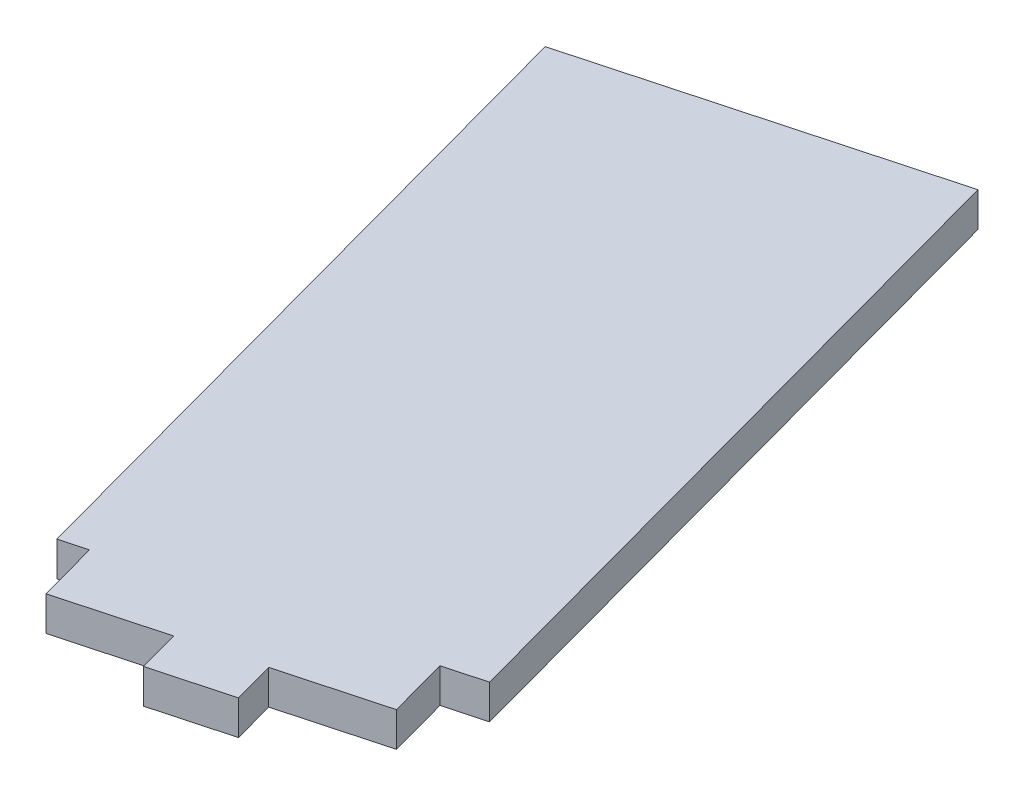
ISO-10303-21;
HEADER;
FILE_DESCRIPTION(('STEP AP214'),'2;1');
FILE_NAME('part.step','',(''),(''),'','','');
FILE_SCHEMA(('AUTOMOTIVE_DESIGN { 1 0 10303 214 1 1 1 1 }'));
ENDSEC;
DATA;
#1=APPLICATION_CONTEXT('core data for automotive mechanical design processes');
#2=APPLICATION_PROTOCOL_DEFINITION('international standard','automotive_design',2000,#1);
#3=PRODUCT_CONTEXT('',#1,'mechanical');
#4=PRODUCT('Part','Part','',(#3));
#5=PRODUCT_RELATED_PRODUCT_CATEGORY('part','',(#4));
#6=PRODUCT_DEFINITION_FORMATION('','',#4);
#7=PRODUCT_DEFINITION_CONTEXT('part definition',#1,'design');
#8=PRODUCT_DEFINITION('design','',#6,#7);
#9=PRODUCT_DEFINITION_SHAPE('','',#8);
#10=(LENGTH_UNIT() NAMED_UNIT(*) SI_UNIT(.MILLI.,.METRE.));
#11=(NAMED_UNIT(*) PLANE_ANGLE_UNIT() SI_UNIT($,.RADIAN.));
#12=(NAMED_UNIT(*) SI_UNIT($,.STERADIAN.) SOLID_ANGLE_UNIT());
#13=UNCERTAINTY_MEASURE_WITH_UNIT(LENGTH_MEASURE(1.E-05),#10,'distance_accuracy_value','');
#14=(GEOMETRIC_REPRESENTATION_CONTEXT(3) GLOBAL_UNCERTAINTY_ASSIGNED_CONTEXT((#13)) GLOBAL_UNIT_ASSIGNED_CONTEXT((#10,
#11,#12)) REPRESENTATION_CONTEXT('',''));
#15=CARTESIAN_POINT('',(0.,0.,0.));
#16=DIRECTION('',(0.,0.,1.));
#17=DIRECTION('',(1.,0.,0.));
#18=AXIS2_PLACEMENT_3D('',#15,#16,#17);
#19=CARTESIAN_POINT('',(0.992957909737777,2.54,17.5493290896596));
#20=DIRECTION('',(0.965002896745535,0.,-0.262239221461486));
#21=DIRECTION('',(-0.262239221461486,0.,-0.965002896745535));
#22=AXIS2_PLACEMENT_3D('',#19,#20,#21);
#23=PLANE('',#22);
#24=DIRECTION('',(0.262239221461486,0.,0.965002896745535));
#25=VECTOR('',#24,1.);
#26=CARTESIAN_POINT('',(0.992957909737777,0.,17.5493290896596));
#27=LINE('',#26,#25);
#28=CARTESIAN_POINT('',(-12.4620120650081,0.,-31.9630395365603));
#29=VERTEX_POINT('',#28);
#30=CARTESIAN_POINT('',(0.992957909737777,0.,17.5493290896596));
#31=VERTEX_POINT('',#30);
#32=EDGE_CURVE('E155',#29,#31,#27,.T.);
#33=ORIENTED_EDGE('',*,*,#32,.T.);
#34=DIRECTION('',(0.,-1.,0.));
#35=VECTOR('',#34,1.);
#36=CARTESIAN_POINT('',(0.992957909737777,2.54,17.5493290896596));
#37=LINE('',#36,#35);
#38=CARTESIAN_POINT('',(0.992957909737777,2.54,17.5493290896596));
#39=VERTEX_POINT('',#38);
#40=EDGE_CURVE('E11',#39,#31,#37,.T.);
#41=ORIENTED_EDGE('',*,*,#40,.F.);
#42=DIRECTION('',(0.262239221461486,0.,0.965002896745535));
#43=VECTOR('',#42,1.);
#44=CARTESIAN_POINT('',(0.992957909737777,2.54,17.5493290896596));
#45=LINE('',#44,#43);
#46=CARTESIAN_POINT('',(-12.4620120650081,2.54,-31.9630395365603));
#47=VERTEX_POINT('',#46);
#48=EDGE_CURVE('E177',#47,#39,#45,.T.);
#49=ORIENTED_EDGE('',*,*,#48,.F.);
#50=DIRECTION('',(0.,-1.,0.));
#51=VECTOR('',#50,1.);
#52=CARTESIAN_POINT('',(-12.4620120650081,2.54,-31.9630395365603));
#53=LINE('',#52,#51);
#54=EDGE_CURVE('E151',#47,#29,#53,.T.);
#55=ORIENTED_EDGE('',*,*,#54,.T.);
#56=EDGE_LOOP('',(#33,#41,#49,#55));
#57=FACE_BOUND('',#56,.T.);
#58=ADVANCED_FACE('F35',(#57),#23,.F.);
#59=CARTESIAN_POINT('',(0.992957909737777,2.54,17.5493290896596));
#60=DIRECTION('',(-0.262239221461486,0.,-0.965002896745535));
#61=DIRECTION('',(-0.965002896745535,0.,0.262239221461486));
#62=AXIS2_PLACEMENT_3D('',#59,#60,#61);
#63=PLANE('',#62);
#64=DIRECTION('',(0.965002896745535,0.,-0.262239221461486));
#65=VECTOR('',#64,1.);
#66=CARTESIAN_POINT('',(0.992957909737777,0.,17.5493290896596));
#67=LINE('',#66,#65);
#68=CARTESIAN_POINT('',(2.8925661119829,0.,17.0331111822123));
#69=VERTEX_POINT('',#68);
#70=EDGE_CURVE('E158',#31,#69,#67,.T.);
#71=ORIENTED_EDGE('',*,*,#70,.T.);
#72=DIRECTION('',(0.,-1.,0.));
#73=VECTOR('',#72,1.);
#74=CARTESIAN_POINT('',(2.8925661119829,2.54,17.0331111822123));
#75=LINE('',#74,#73);
#76=CARTESIAN_POINT('',(2.8925661119829,2.54,17.0331111822123));
#77=VERTEX_POINT('',#76);
#78=EDGE_CURVE('E43',#77,#69,#75,.T.);
#79=ORIENTED_EDGE('',*,*,#78,.F.);
#80=DIRECTION('',(0.965002896745535,0.,-0.262239221461486));
#81=VECTOR('',#80,1.);
#82=CARTESIAN_POINT('',(0.992957909737777,2.54,17.5493290896596));
#83=LINE('',#82,#81);
#84=EDGE_CURVE('E106',#39,#77,#83,.T.);
#85=ORIENTED_EDGE('',*,*,#84,.F.);
#86=ORIENTED_EDGE('',*,*,#40,.T.);
#87=EDGE_LOOP('',(#71,#79,#85,#86));
#88=FACE_BOUND('',#87,.T.);
#89=ADVANCED_FACE('F255',(#88),#63,.F.);
#90=CARTESIAN_POINT('',(2.8925661119829,2.54,17.0331111822123));
#91=DIRECTION('',(0.965002896745522,0.,-0.262239221461533));
#92=DIRECTION('',(-0.262239221461533,0.,-0.965002896745522));
#93=AXIS2_PLACEMENT_3D('',#90,#91,#92);
#94=PLANE('',#93);
#95=DIRECTION('',(0.262239221461533,0.,0.965002896745522));
#96=VECTOR('',#95,1.);
#97=CARTESIAN_POINT('',(2.8925661119829,0.,17.0331111822123));
#98=LINE('',#97,#96);
#99=CARTESIAN_POINT('',(4.09152383250502,0.,21.4451044261328));
#100=VERTEX_POINT('',#99);
#101=EDGE_CURVE('E160',#69,#100,#98,.T.);
#102=ORIENTED_EDGE('',*,*,#101,.T.);
#103=DIRECTION('',(0.,-1.,0.));
#104=VECTOR('',#103,1.);
#105=CARTESIAN_POINT('',(4.09152383250502,2.54,21.4451044261328));
#106=LINE('',#105,#104);
#107=CARTESIAN_POINT('',(4.09152383250502,2.54,21.4451044261328));
#108=VERTEX_POINT('',#107);
#109=EDGE_CURVE('E196',#108,#100,#106,.T.);
#110=ORIENTED_EDGE('',*,*,#109,.F.);
#111=DIRECTION('',(0.262239221461533,0.,0.965002896745522));
#112=VECTOR('',#111,1.);
#113=CARTESIAN_POINT('',(2.8925661119829,2.54,17.0331111822123));
#114=LINE('',#113,#112);
#115=EDGE_CURVE('E204',#77,#108,#114,.T.);
#116=ORIENTED_EDGE('',*,*,#115,.F.);
#117=ORIENTED_EDGE('',*,*,#78,.T.);
#118=EDGE_LOOP('',(#102,#110,#116,#117));
#119=FACE_BOUND('',#118,.T.);
#120=ADVANCED_FACE('F202',(#119),#94,.F.);
#121=CARTESIAN_POINT('',(4.09152383250502,2.54,21.4451044261328));
#122=DIRECTION('',(-0.262239221461487,0.,-0.965002896745535));
#123=DIRECTION('',(-0.965002896745535,0.,0.262239221461487));
#124=AXIS2_PLACEMENT_3D('',#121,#122,#123);
#125=PLANE('',#124);
#126=DIRECTION('',(0.965002896745535,0.,-0.262239221461487));
#127=VECTOR('',#126,1.);
#128=CARTESIAN_POINT('',(4.09152383250502,0.,21.4451044261328));
#129=LINE('',#128,#127);
#130=CARTESIAN_POINT('',(11.5061235896493,0.,19.4301893680334));
#131=VERTEX_POINT('',#130);
#132=EDGE_CURVE('E162',#100,#131,#129,.T.);
#133=ORIENTED_EDGE('',*,*,#132,.T.);
#134=DIRECTION('',(0.,-1.,0.));
#135=VECTOR('',#134,1.);
#136=CARTESIAN_POINT('',(11.5061235896493,2.54,19.4301893680334));
#137=LINE('',#136,#135);
#138=CARTESIAN_POINT('',(11.5061235896493,2.54,19.4301893680334));
#139=VERTEX_POINT('',#138);
#140=EDGE_CURVE('E193',#139,#131,#137,.T.);
#141=ORIENTED_EDGE('',*,*,#140,.F.);
#142=DIRECTION('',(0.965002896745535,0.,-0.262239221461487));
#143=VECTOR('',#142,1.);
#144=CARTESIAN_POINT('',(4.09152383250502,2.54,21.4451044261328));
#145=LINE('',#144,#143);
#146=EDGE_CURVE('E222',#108,#139,#145,.T.);
#147=ORIENTED_EDGE('',*,*,#146,.F.);
#148=ORIENTED_EDGE('',*,*,#109,.T.);
#149=EDGE_LOOP('',(#133,#141,#147,#148));
#150=FACE_BOUND('',#149,.T.);
#151=ADVANCED_FACE('F213',(#150),#125,.F.);
#152=CARTESIAN_POINT('',(11.5061235896493,2.54,19.4301893680334));
#153=DIRECTION('',(0.965002896745535,0.,-0.262239221461487));
#154=DIRECTION('',(-0.262239221461487,0.,-0.965002896745535));
#155=AXIS2_PLACEMENT_3D('',#152,#153,#154);
#156=PLANE('',#155);
#157=DIRECTION('',(0.262239221461487,0.,0.965002896745535));
#158=VECTOR('',#157,1.);
#159=CARTESIAN_POINT('',(11.5061235896493,0.,19.4301893680334));
#160=LINE('',#159,#158);
#161=CARTESIAN_POINT('',(12.3387331177896,0.,22.4940735652005));
#162=VERTEX_POINT('',#161);
#163=EDGE_CURVE('E164',#131,#162,#160,.T.);
#164=ORIENTED_EDGE('',*,*,#163,.T.);
#165=DIRECTION('',(0.,-1.,0.));
#166=VECTOR('',#165,1.);
#167=CARTESIAN_POINT('',(12.3387331177896,2.54,22.4940735652005));
#168=LINE('',#167,#166);
#169=CARTESIAN_POINT('',(12.3387331177896,2.54,22.4940735652005));
#170=VERTEX_POINT('',#169);
#171=EDGE_CURVE('E190',#170,#162,#168,.T.);
#172=ORIENTED_EDGE('',*,*,#171,.F.);
#173=DIRECTION('',(0.262239221461487,0.,0.965002896745535));
#174=VECTOR('',#173,1.);
#175=CARTESIAN_POINT('',(11.5061235896493,2.54,19.4301893680334));
#176=LINE('',#175,#174);
#177=EDGE_CURVE('E219',#139,#170,#176,.T.);
#178=ORIENTED_EDGE('',*,*,#177,.F.);
#179=ORIENTED_EDGE('',*,*,#140,.T.);
#180=EDGE_LOOP('',(#164,#172,#178,#179));
#181=FACE_BOUND('',#180,.T.);
#182=ADVANCED_FACE('F217',(#181),#156,.F.);
#183=CARTESIAN_POINT('',(12.3387331177896,2.54,22.4940735652005));
#184=DIRECTION('',(-0.262239221461487,0.,-0.965002896745535));
#185=DIRECTION('',(-0.965002896745535,0.,0.262239221461487));
#186=AXIS2_PLACEMENT_3D('',#183,#184,#185);
#187=PLANE('',#186);
#188=DIRECTION('',(0.965002896745535,0.,-0.262239221461487));
#189=VECTOR('',#188,1.);
#190=CARTESIAN_POINT('',(12.3387331177896,0.,22.4940735652005));
#191=LINE('',#190,#189);
#192=CARTESIAN_POINT('',(17.8537246726903,0.,20.9953764145481));
#193=VERTEX_POINT('',#192);
#194=EDGE_CURVE('E166',#162,#193,#191,.T.);
#195=ORIENTED_EDGE('',*,*,#194,.T.);
#196=DIRECTION('',(0.,-1.,0.));
#197=VECTOR('',#196,1.);
#198=CARTESIAN_POINT('',(17.8537246726903,2.54,20.9953764145481));
#199=LINE('',#198,#197);
#200=CARTESIAN_POINT('',(17.8537246726903,2.54,20.9953764145481));
#201=VERTEX_POINT('',#200);
#202=EDGE_CURVE('E187',#201,#193,#199,.T.);
#203=ORIENTED_EDGE('',*,*,#202,.F.);
#204=DIRECTION('',(0.965002896745535,0.,-0.262239221461487));
#205=VECTOR('',#204,1.);
#206=CARTESIAN_POINT('',(12.3387331177896,2.54,22.4940735652005));
#207=LINE('',#206,#205);
#208=EDGE_CURVE('E221',#170,#201,#207,.T.);
#209=ORIENTED_EDGE('',*,*,#208,.F.);
#210=ORIENTED_EDGE('',*,*,#171,.T.);
#211=EDGE_LOOP('',(#195,#203,#209,#210));
#212=FACE_BOUND('',#211,.T.);
#213=ADVANCED_FACE('F268',(#212),#187,.F.);
#214=CARTESIAN_POINT('',(17.8537246726903,2.54,20.9953764145481));
#215=DIRECTION('',(-0.965002896745535,0.,0.262239221461486));
#216=DIRECTION('',(0.262239221461486,0.,0.965002896745535));
#217=AXIS2_PLACEMENT_3D('',#214,#215,#216);
#218=PLANE('',#217);
#219=DIRECTION('',(-0.262239221461486,0.,-0.965002896745535));
#220=VECTOR('',#219,1.);
#221=CARTESIAN_POINT('',(17.8537246726903,0.,20.9953764145481));
#222=LINE('',#221,#220);
#223=CARTESIAN_POINT('',(17.0211151445492,0.,17.9314922173777));
#224=VERTEX_POINT('',#223);
#225=EDGE_CURVE('E168',#193,#224,#222,.T.);
#226=ORIENTED_EDGE('',*,*,#225,.T.);
#227=DIRECTION('',(0.,-1.,0.));
#228=VECTOR('',#227,1.);
#229=CARTESIAN_POINT('',(17.0211151445492,2.54,17.9314922173777));
#230=LINE('',#229,#228);
#231=CARTESIAN_POINT('',(17.0211151445492,2.54,17.9314922173777));
#232=VERTEX_POINT('',#231);
#233=EDGE_CURVE('E184',#232,#224,#230,.T.);
#234=ORIENTED_EDGE('',*,*,#233,.F.);
#235=DIRECTION('',(-0.262239221461486,0.,-0.965002896745535));
#236=VECTOR('',#235,1.);
#237=CARTESIAN_POINT('',(17.8537246726903,2.54,20.9953764145481));
#238=LINE('',#237,#236);
#239=EDGE_CURVE('E224',#201,#232,#238,.T.);
#240=ORIENTED_EDGE('',*,*,#239,.F.);
#241=ORIENTED_EDGE('',*,*,#202,.T.);
#242=EDGE_LOOP('',(#226,#234,#240,#241));
#243=FACE_BOUND('',#242,.T.);
#244=ADVANCED_FACE('F271',(#243),#218,.F.);
#245=CARTESIAN_POINT('',(17.0211151445492,2.54,17.9314922173777));
#246=DIRECTION('',(-0.262239221461474,0.,-0.965002896745538));
#247=DIRECTION('',(-0.965002896745538,0.,0.262239221461475));
#248=AXIS2_PLACEMENT_3D('',#245,#246,#247);
#249=PLANE('',#248);
#250=DIRECTION('',(0.965002896745538,0.,-0.262239221461474));
#251=VECTOR('',#250,1.);
#252=CARTESIAN_POINT('',(17.0211151445492,0.,17.9314922173777));
#253=LINE('',#252,#251);
#254=CARTESIAN_POINT('',(24.4357149016935,0.,15.9165771592785));
#255=VERTEX_POINT('',#254);
#256=EDGE_CURVE('E170',#224,#255,#253,.T.);
#257=ORIENTED_EDGE('',*,*,#256,.T.);
#258=DIRECTION('',(0.,-1.,0.));
#259=VECTOR('',#258,1.);
#260=CARTESIAN_POINT('',(24.4357149016935,2.54,15.9165771592785));
#261=LINE('',#260,#259);
#262=CARTESIAN_POINT('',(24.4357149016935,2.54,15.9165771592785));
#263=VERTEX_POINT('',#262);
#264=EDGE_CURVE('E181',#263,#255,#261,.T.);
#265=ORIENTED_EDGE('',*,*,#264,.F.);
#266=DIRECTION('',(0.965002896745538,0.,-0.262239221461474));
#267=VECTOR('',#266,1.);
#268=CARTESIAN_POINT('',(17.0211151445492,2.54,17.9314922173777));
#269=LINE('',#268,#267);
#270=EDGE_CURVE('E230',#232,#263,#269,.T.);
#271=ORIENTED_EDGE('',*,*,#270,.F.);
#272=ORIENTED_EDGE('',*,*,#233,.T.);
#273=EDGE_LOOP('',(#257,#265,#271,#272));
#274=FACE_BOUND('',#273,.T.);
#275=ADVANCED_FACE('F236',(#274),#249,.F.);
#276=CARTESIAN_POINT('',(24.4357149016935,2.54,15.9165771592785));
#277=DIRECTION('',(-0.965002896745535,0.,0.262239221461486));
#278=DIRECTION('',(0.262239221461486,0.,0.965002896745535));
#279=AXIS2_PLACEMENT_3D('',#276,#277,#278);
#280=PLANE('',#279);
#281=DIRECTION('',(-0.262239221461486,0.,-0.965002896745535));
#282=VECTOR('',#281,1.);
#283=CARTESIAN_POINT('',(24.4357149016935,0.,15.9165771592785));
#284=LINE('',#283,#282);
#285=CARTESIAN_POINT('',(23.2367571811725,0.,11.5045839153612));
#286=VERTEX_POINT('',#285);
#287=EDGE_CURVE('E172',#255,#286,#284,.T.);
#288=ORIENTED_EDGE('',*,*,#287,.T.);
#289=DIRECTION('',(0.,-1.,0.));
#290=VECTOR('',#289,1.);
#291=CARTESIAN_POINT('',(23.2367571811725,2.54,11.5045839153612));
#292=LINE('',#291,#290);
#293=CARTESIAN_POINT('',(23.2367571811725,2.54,11.5045839153612));
#294=VERTEX_POINT('',#293);
#295=EDGE_CURVE('E146',#294,#286,#292,.T.);
#296=ORIENTED_EDGE('',*,*,#295,.F.);
#297=DIRECTION('',(-0.262239221461486,0.,-0.965002896745535));
#298=VECTOR('',#297,1.);
#299=CARTESIAN_POINT('',(24.4357149016935,2.54,15.9165771592785));
#300=LINE('',#299,#298);
#301=EDGE_CURVE('E137',#263,#294,#300,.T.);
#302=ORIENTED_EDGE('',*,*,#301,.F.);
#303=ORIENTED_EDGE('',*,*,#264,.T.);
#304=EDGE_LOOP('',(#288,#296,#302,#303));
#305=FACE_BOUND('',#304,.T.);
#306=ADVANCED_FACE('F240',(#305),#280,.F.);
#307=CARTESIAN_POINT('',(23.2367571811725,2.54,11.5045839153612));
#308=DIRECTION('',(-0.262239221461488,0.,-0.965002896745534));
#309=DIRECTION('',(-0.965002896745535,0.,0.262239221461488));
#310=AXIS2_PLACEMENT_3D('',#307,#308,#309);
#311=PLANE('',#310);
#312=DIRECTION('',(0.965002896745534,0.,-0.262239221461488));
#313=VECTOR('',#312,1.);
#314=CARTESIAN_POINT('',(23.2367571811725,0.,11.5045839153612));
#315=LINE('',#314,#313);
#316=CARTESIAN_POINT('',(26.1168083265078,0.,10.7219309589098));
#317=VERTEX_POINT('',#316);
#318=EDGE_CURVE('E145',#286,#317,#315,.T.);
#319=ORIENTED_EDGE('',*,*,#318,.T.);
#320=DIRECTION('',(0.,-1.,0.));
#321=VECTOR('',#320,1.);
#322=CARTESIAN_POINT('',(26.1168083265078,2.54,10.7219309589098));
#323=LINE('',#322,#321);
#324=CARTESIAN_POINT('',(26.1168083265078,2.54,10.7219309589098));
#325=VERTEX_POINT('',#324);
#326=EDGE_CURVE('E142',#325,#317,#323,.T.);
#327=ORIENTED_EDGE('',*,*,#326,.F.);
#328=DIRECTION('',(0.965002896745534,0.,-0.262239221461488));
#329=VECTOR('',#328,1.);
#330=CARTESIAN_POINT('',(23.2367571811725,2.54,11.5045839153612));
#331=LINE('',#330,#329);
#332=EDGE_CURVE('E131',#294,#325,#331,.T.);
#333=ORIENTED_EDGE('',*,*,#332,.F.);
#334=ORIENTED_EDGE('',*,*,#295,.T.);
#335=EDGE_LOOP('',(#319,#327,#333,#334));
#336=FACE_BOUND('',#335,.T.);
#337=ADVANCED_FACE('F143',(#336),#311,.F.);
#338=CARTESIAN_POINT('',(12.6618383517619,2.54,-38.7904376673101));
#339=DIRECTION('',(-0.965002896745535,0.,0.262239221461486));
#340=DIRECTION('',(0.262239221461486,0.,0.965002896745535));
#341=AXIS2_PLACEMENT_3D('',#338,#339,#340);
#342=PLANE('',#341);
#343=DIRECTION('',(-0.262239221461486,0.,-0.965002896745535));
#344=VECTOR('',#343,1.);
#345=CARTESIAN_POINT('',(12.6618383517619,0.,-38.7904376673101));
#346=LINE('',#345,#344);
#347=CARTESIAN_POINT('',(12.6618383517619,0.,-38.7904376673101));
#348=VERTEX_POINT('',#347);
#349=EDGE_CURVE('E92',#317,#348,#346,.T.);
#350=ORIENTED_EDGE('',*,*,#349,.T.);
#351=DIRECTION('',(0.,-1.,0.));
#352=VECTOR('',#351,1.);
#353=CARTESIAN_POINT('',(12.6618383517619,2.54,-38.7904376673101));
#354=LINE('',#353,#352);
#355=CARTESIAN_POINT('',(12.6618383517619,2.54,-38.7904376673101));
#356=VERTEX_POINT('',#355);
#357=EDGE_CURVE('E147',#356,#348,#354,.T.);
#358=ORIENTED_EDGE('',*,*,#357,.F.);
#359=DIRECTION('',(-0.262239221461486,0.,-0.965002896745535));
#360=VECTOR('',#359,1.);
#361=CARTESIAN_POINT('',(12.6618383517619,2.54,-38.7904376673101));
#362=LINE('',#361,#360);
#363=EDGE_CURVE('E135',#325,#356,#362,.T.);
#364=ORIENTED_EDGE('',*,*,#363,.F.);
#365=ORIENTED_EDGE('',*,*,#326,.T.);
#366=EDGE_LOOP('',(#350,#358,#364,#365));
#367=FACE_BOUND('',#366,.T.);
#368=ADVANCED_FACE('F149',(#367),#342,.F.);
#369=CARTESIAN_POINT('',(-12.4620120650081,2.54,-31.9630395365603));
#370=DIRECTION('',(0.262239221461485,0.,0.965002896745535));
#371=DIRECTION('',(0.965002896745536,0.,-0.262239221461485));
#372=AXIS2_PLACEMENT_3D('',#369,#370,#371);
#373=PLANE('',#372);
#374=DIRECTION('',(-0.965002896745535,0.,0.262239221461485));
#375=VECTOR('',#374,1.);
#376=CARTESIAN_POINT('',(-12.4620120650081,0.,-31.9630395365603));
#377=LINE('',#376,#375);
#378=EDGE_CURVE('E98',#348,#29,#377,.T.);
#379=ORIENTED_EDGE('',*,*,#378,.T.);
#380=ORIENTED_EDGE('',*,*,#54,.F.);
#381=DIRECTION('',(-0.965002896745535,0.,0.262239221461485));
#382=VECTOR('',#381,1.);
#383=CARTESIAN_POINT('',(-12.4620120650081,2.54,-31.9630395365603));
#384=LINE('',#383,#382);
#385=EDGE_CURVE('E51',#356,#47,#384,.T.);
#386=ORIENTED_EDGE('',*,*,#385,.F.);
#387=ORIENTED_EDGE('',*,*,#357,.T.);
#388=EDGE_LOOP('',(#379,#380,#386,#387));
#389=FACE_BOUND('',#388,.T.);
#390=ADVANCED_FACE('F244',(#389),#373,.F.);
#391=CARTESIAN_POINT('',(0.,2.54,0.));
#392=DIRECTION('',(0.,-1.,0.));
#393=DIRECTION('',(0.,0.,-1.));
#394=AXIS2_PLACEMENT_3D('',#391,#392,#393);
#395=PLANE('',#394);
#396=ORIENTED_EDGE('',*,*,#48,.T.);
#397=ORIENTED_EDGE('',*,*,#84,.T.);
#398=ORIENTED_EDGE('',*,*,#115,.T.);
#399=ORIENTED_EDGE('',*,*,#146,.T.);
#400=ORIENTED_EDGE('',*,*,#177,.T.);
#401=ORIENTED_EDGE('',*,*,#208,.T.);
#402=ORIENTED_EDGE('',*,*,#239,.T.);
#403=ORIENTED_EDGE('',*,*,#270,.T.);
#404=ORIENTED_EDGE('',*,*,#301,.T.);
#405=ORIENTED_EDGE('',*,*,#332,.T.);
#406=ORIENTED_EDGE('',*,*,#363,.T.);
#407=ORIENTED_EDGE('',*,*,#385,.T.);
#408=EDGE_LOOP('',(#396,#397,#398,#399,#400,#401,#402,#403,#404,#405,#406,#407));
#409=FACE_BOUND('',#408,.T.);
#410=ADVANCED_FACE('F133',(#409),#395,.F.);
#411=CARTESIAN_POINT('',(0.,0.,0.));
#412=DIRECTION('',(0.,-1.,0.));
#413=DIRECTION('',(0.,0.,-1.));
#414=AXIS2_PLACEMENT_3D('',#411,#412,#413);
#415=PLANE('',#414);
#416=ORIENTED_EDGE('',*,*,#32,.F.);
#417=ORIENTED_EDGE('',*,*,#378,.F.);
#418=ORIENTED_EDGE('',*,*,#349,.F.);
#419=ORIENTED_EDGE('',*,*,#318,.F.);
#420=ORIENTED_EDGE('',*,*,#287,.F.);
#421=ORIENTED_EDGE('',*,*,#256,.F.);
#422=ORIENTED_EDGE('',*,*,#225,.F.);
#423=ORIENTED_EDGE('',*,*,#194,.F.);
#424=ORIENTED_EDGE('',*,*,#163,.F.);
#425=ORIENTED_EDGE('',*,*,#132,.F.);
#426=ORIENTED_EDGE('',*,*,#101,.F.);
#427=ORIENTED_EDGE('',*,*,#70,.F.);
#428=EDGE_LOOP('',(#416,#417,#418,#419,#420,#421,#422,#423,#424,#425,#426,#427));
#429=FACE_BOUND('',#428,.T.);
#430=ADVANCED_FACE('F208',(#429),#415,.T.);
#431=CLOSED_SHELL('',(#58,#89,#120,#151,#182,#213,#244,#275,#306,#337,#368,#390,#410,#430));
#432=MANIFOLD_SOLID_BREP('B2',#431);
#433=ADVANCED_BREP_SHAPE_REPRESENTATION('',(#18,#432),#14);
#434=SHAPE_DEFINITION_REPRESENTATION(#9,#433);
ENDSEC;
END-ISO-10303-21;
